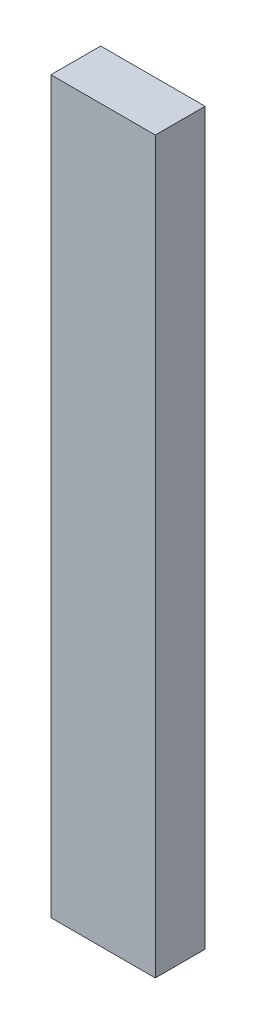
ISO-10303-21;
HEADER;
FILE_DESCRIPTION(('STEP AP214'),'2;1');
FILE_NAME('part.step','',(''),(''),'','','');
FILE_SCHEMA(('AUTOMOTIVE_DESIGN { 1 0 10303 214 1 1 1 1 }'));
ENDSEC;
DATA;
#1=APPLICATION_CONTEXT('core data for automotive mechanical design processes');
#2=APPLICATION_PROTOCOL_DEFINITION('international standard','automotive_design',2000,#1);
#3=PRODUCT_CONTEXT('',#1,'mechanical');
#4=PRODUCT('Part','Part','',(#3));
#5=PRODUCT_RELATED_PRODUCT_CATEGORY('part','',(#4));
#6=PRODUCT_DEFINITION_FORMATION('','',#4);
#7=PRODUCT_DEFINITION_CONTEXT('part definition',#1,'design');
#8=PRODUCT_DEFINITION('design','',#6,#7);
#9=PRODUCT_DEFINITION_SHAPE('','',#8);
#10=(LENGTH_UNIT() NAMED_UNIT(*) SI_UNIT(.MILLI.,.METRE.));
#11=(NAMED_UNIT(*) PLANE_ANGLE_UNIT() SI_UNIT($,.RADIAN.));
#12=(NAMED_UNIT(*) SI_UNIT($,.STERADIAN.) SOLID_ANGLE_UNIT());
#13=UNCERTAINTY_MEASURE_WITH_UNIT(LENGTH_MEASURE(1.E-05),#10,'distance_accuracy_value','');
#14=(GEOMETRIC_REPRESENTATION_CONTEXT(3) GLOBAL_UNCERTAINTY_ASSIGNED_CONTEXT((#13)) GLOBAL_UNIT_ASSIGNED_CONTEXT((#10,
#11,#12)) REPRESENTATION_CONTEXT('',''));
#15=CARTESIAN_POINT('',(0.,0.,0.));
#16=DIRECTION('',(0.,0.,1.));
#17=DIRECTION('',(1.,0.,0.));
#18=AXIS2_PLACEMENT_3D('',#15,#16,#17);
#19=CARTESIAN_POINT('',(0.31449264,-2.19949014,0.2999994));
#20=DIRECTION('',(0.,0.,1.));
#21=DIRECTION('',(1.,0.,0.));
#22=AXIS2_PLACEMENT_3D('',#19,#20,#21);
#23=PLANE('',#22);
#24=DIRECTION('',(0.,1.,0.));
#25=VECTOR('',#24,1.);
#26=CARTESIAN_POINT('',(-0.31449264,-2.19949014,0.2999994));
#27=LINE('',#26,#25);
#28=CARTESIAN_POINT('',(-0.31449264,-2.19949014,0.2999994));
#29=VERTEX_POINT('',#28);
#30=CARTESIAN_POINT('',(-0.31449264,2.19949268,0.2999994));
#31=VERTEX_POINT('',#30);
#32=EDGE_CURVE('E52',#29,#31,#27,.T.);
#33=ORIENTED_EDGE('',*,*,#32,.F.);
#34=DIRECTION('',(1.,0.,0.));
#35=VECTOR('',#34,1.);
#36=CARTESIAN_POINT('',(0.31449264,-2.19949014,0.2999994));
#37=LINE('',#36,#35);
#38=CARTESIAN_POINT('',(0.31449264,-2.19949014,0.2999994));
#39=VERTEX_POINT('',#38);
#40=EDGE_CURVE('E19',#29,#39,#37,.T.);
#41=ORIENTED_EDGE('',*,*,#40,.T.);
#42=DIRECTION('',(0.,1.,0.));
#43=VECTOR('',#42,1.);
#44=CARTESIAN_POINT('',(0.31449264,2.19949268,0.2999994));
#45=LINE('',#44,#43);
#46=CARTESIAN_POINT('',(0.31449264,2.19949268,0.2999994));
#47=VERTEX_POINT('',#46);
#48=EDGE_CURVE('E66',#47,#39,#45,.F.);
#49=ORIENTED_EDGE('',*,*,#48,.F.);
#50=DIRECTION('',(1.,0.,0.));
#51=VECTOR('',#50,1.);
#52=CARTESIAN_POINT('',(-0.31449264,2.19949268,0.2999994));
#53=LINE('',#52,#51);
#54=EDGE_CURVE('E57',#31,#47,#53,.T.);
#55=ORIENTED_EDGE('',*,*,#54,.F.);
#56=EDGE_LOOP('',(#33,#41,#49,#55));
#57=FACE_BOUND('',#56,.T.);
#58=ADVANCED_FACE('F16',(#57),#23,.T.);
#59=CARTESIAN_POINT('',(0.31449264,2.19949268,0.));
#60=DIRECTION('',(1.,0.,0.));
#61=DIRECTION('',(0.,0.,-1.));
#62=AXIS2_PLACEMENT_3D('',#59,#60,#61);
#63=PLANE('',#62);
#64=DIRECTION('',(0.,0.,-1.));
#65=VECTOR('',#64,1.);
#66=CARTESIAN_POINT('',(0.31449264,-2.19949014,0.));
#67=LINE('',#66,#65);
#68=CARTESIAN_POINT('',(0.31449264,-2.19949014,0.));
#69=VERTEX_POINT('',#68);
#70=EDGE_CURVE('E79',#69,#39,#67,.F.);
#71=ORIENTED_EDGE('',*,*,#70,.F.);
#72=DIRECTION('',(0.,1.,0.));
#73=VECTOR('',#72,1.);
#74=CARTESIAN_POINT('',(0.31449264,-2.19949014,0.));
#75=LINE('',#74,#73);
#76=CARTESIAN_POINT('',(0.31449264,2.19949268,0.));
#77=VERTEX_POINT('',#76);
#78=EDGE_CURVE('E74',#69,#77,#75,.T.);
#79=ORIENTED_EDGE('',*,*,#78,.T.);
#80=DIRECTION('',(0.,0.,1.));
#81=VECTOR('',#80,1.);
#82=CARTESIAN_POINT('',(0.31449264,2.19949268,0.));
#83=LINE('',#82,#81);
#84=EDGE_CURVE('E62',#47,#77,#83,.F.);
#85=ORIENTED_EDGE('',*,*,#84,.F.);
#86=ORIENTED_EDGE('',*,*,#48,.T.);
#87=EDGE_LOOP('',(#71,#79,#85,#86));
#88=FACE_BOUND('',#87,.T.);
#89=ADVANCED_FACE('F73',(#88),#63,.T.);
#90=CARTESIAN_POINT('',(-0.31449264,2.19949268,0.));
#91=DIRECTION('',(0.,1.,0.));
#92=DIRECTION('',(0.,0.,1.));
#93=AXIS2_PLACEMENT_3D('',#90,#91,#92);
#94=PLANE('',#93);
#95=ORIENTED_EDGE('',*,*,#84,.T.);
#96=DIRECTION('',(1.,0.,0.));
#97=VECTOR('',#96,1.);
#98=CARTESIAN_POINT('',(0.31449264,2.19949268,0.));
#99=LINE('',#98,#97);
#100=CARTESIAN_POINT('',(-0.31449264,2.19949268,0.));
#101=VERTEX_POINT('',#100);
#102=EDGE_CURVE('E83',#77,#101,#99,.F.);
#103=ORIENTED_EDGE('',*,*,#102,.T.);
#104=DIRECTION('',(0.,0.,1.));
#105=VECTOR('',#104,1.);
#106=CARTESIAN_POINT('',(-0.31449264,2.19949268,0.));
#107=LINE('',#106,#105);
#108=EDGE_CURVE('E64',#31,#101,#107,.F.);
#109=ORIENTED_EDGE('',*,*,#108,.F.);
#110=ORIENTED_EDGE('',*,*,#54,.T.);
#111=EDGE_LOOP('',(#95,#103,#109,#110));
#112=FACE_BOUND('',#111,.T.);
#113=ADVANCED_FACE('F59',(#112),#94,.T.);
#114=CARTESIAN_POINT('',(-0.31449264,-2.19949014,0.));
#115=DIRECTION('',(-1.,0.,0.));
#116=DIRECTION('',(0.,0.,1.));
#117=AXIS2_PLACEMENT_3D('',#114,#115,#116);
#118=PLANE('',#117);
#119=ORIENTED_EDGE('',*,*,#108,.T.);
#120=DIRECTION('',(0.,1.,0.));
#121=VECTOR('',#120,1.);
#122=CARTESIAN_POINT('',(-0.31449264,-2.19949014,0.));
#123=LINE('',#122,#121);
#124=CARTESIAN_POINT('',(-0.31449264,-2.19949014,0.));
#125=VERTEX_POINT('',#124);
#126=EDGE_CURVE('E25',#101,#125,#123,.F.);
#127=ORIENTED_EDGE('',*,*,#126,.T.);
#128=DIRECTION('',(0.,0.,-1.));
#129=VECTOR('',#128,1.);
#130=CARTESIAN_POINT('',(-0.31449264,-2.19949014,0.));
#131=LINE('',#130,#129);
#132=EDGE_CURVE('E33',#29,#125,#131,.T.);
#133=ORIENTED_EDGE('',*,*,#132,.F.);
#134=ORIENTED_EDGE('',*,*,#32,.T.);
#135=EDGE_LOOP('',(#119,#127,#133,#134));
#136=FACE_BOUND('',#135,.T.);
#137=ADVANCED_FACE('F87',(#136),#118,.T.);
#138=CARTESIAN_POINT('',(0.31449264,-2.19949014,0.));
#139=DIRECTION('',(0.,-1.,0.));
#140=DIRECTION('',(0.,0.,-1.));
#141=AXIS2_PLACEMENT_3D('',#138,#139,#140);
#142=PLANE('',#141);
#143=ORIENTED_EDGE('',*,*,#132,.T.);
#144=DIRECTION('',(1.,0.,0.));
#145=VECTOR('',#144,1.);
#146=CARTESIAN_POINT('',(0.31449264,-2.19949014,0.));
#147=LINE('',#146,#145);
#148=EDGE_CURVE('E10',#125,#69,#147,.T.);
#149=ORIENTED_EDGE('',*,*,#148,.T.);
#150=ORIENTED_EDGE('',*,*,#70,.T.);
#151=ORIENTED_EDGE('',*,*,#40,.F.);
#152=EDGE_LOOP('',(#143,#149,#150,#151));
#153=FACE_BOUND('',#152,.T.);
#154=ADVANCED_FACE('F90',(#153),#142,.T.);
#155=CARTESIAN_POINT('',(0.31449264,-2.19949014,0.));
#156=DIRECTION('',(0.,0.,1.));
#157=DIRECTION('',(1.,0.,0.));
#158=AXIS2_PLACEMENT_3D('',#155,#156,#157);
#159=PLANE('',#158);
#160=ORIENTED_EDGE('',*,*,#126,.F.);
#161=ORIENTED_EDGE('',*,*,#102,.F.);
#162=ORIENTED_EDGE('',*,*,#78,.F.);
#163=ORIENTED_EDGE('',*,*,#148,.F.);
#164=EDGE_LOOP('',(#160,#161,#162,#163));
#165=FACE_BOUND('',#164,.T.);
#166=ADVANCED_FACE('F89',(#165),#159,.F.);
#167=CLOSED_SHELL('',(#58,#89,#113,#137,#154,#166));
#168=MANIFOLD_SOLID_BREP('B1',#167);
#169=ADVANCED_BREP_SHAPE_REPRESENTATION('',(#18,#168),#14);
#170=SHAPE_DEFINITION_REPRESENTATION(#9,#169);
ENDSEC;
END-ISO-10303-21;
